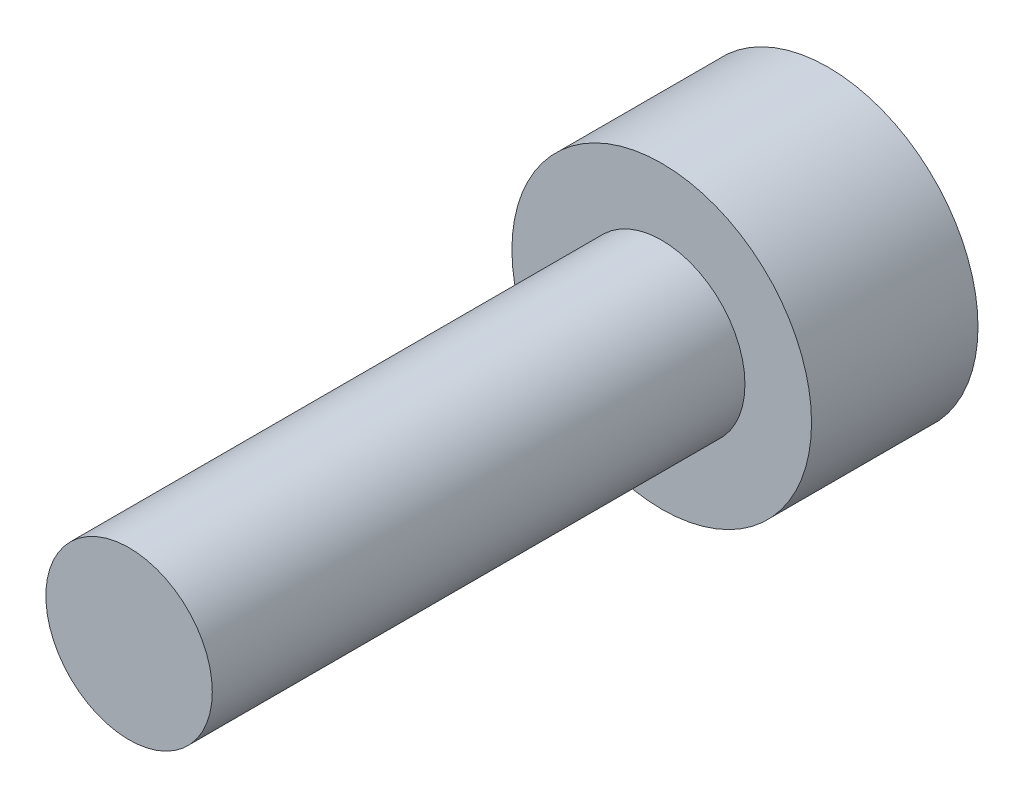
ISO-10303-21;
HEADER;
FILE_DESCRIPTION(('STEP AP214'),'2;1');
FILE_NAME('part.step','',(''),(''),'','','');
FILE_SCHEMA(('AUTOMOTIVE_DESIGN { 1 0 10303 214 1 1 1 1 }'));
ENDSEC;
DATA;
#1=APPLICATION_CONTEXT('core data for automotive mechanical design processes');
#2=APPLICATION_PROTOCOL_DEFINITION('international standard','automotive_design',2000,#1);
#3=PRODUCT_CONTEXT('',#1,'mechanical');
#4=PRODUCT('Part','Part','',(#3));
#5=PRODUCT_RELATED_PRODUCT_CATEGORY('part','',(#4));
#6=PRODUCT_DEFINITION_FORMATION('','',#4);
#7=PRODUCT_DEFINITION_CONTEXT('part definition',#1,'design');
#8=PRODUCT_DEFINITION('design','',#6,#7);
#9=PRODUCT_DEFINITION_SHAPE('','',#8);
#10=(LENGTH_UNIT() NAMED_UNIT(*) SI_UNIT(.MILLI.,.METRE.));
#11=(NAMED_UNIT(*) PLANE_ANGLE_UNIT() SI_UNIT($,.RADIAN.));
#12=(NAMED_UNIT(*) SI_UNIT($,.STERADIAN.) SOLID_ANGLE_UNIT());
#13=UNCERTAINTY_MEASURE_WITH_UNIT(LENGTH_MEASURE(1.E-05),#10,'distance_accuracy_value','');
#14=(GEOMETRIC_REPRESENTATION_CONTEXT(3) GLOBAL_UNCERTAINTY_ASSIGNED_CONTEXT((#13)) GLOBAL_UNIT_ASSIGNED_CONTEXT((#10,
#11,#12)) REPRESENTATION_CONTEXT('',''));
#15=CARTESIAN_POINT('',(0.,0.,0.));
#16=DIRECTION('',(0.,0.,1.));
#17=DIRECTION('',(1.,0.,0.));
#18=AXIS2_PLACEMENT_3D('',#15,#16,#17);
#19=CARTESIAN_POINT('',(0.,0.,-2.5));
#20=DIRECTION('',(0.,0.,1.));
#21=DIRECTION('',(1.,0.,0.));
#22=AXIS2_PLACEMENT_3D('',#19,#20,#21);
#23=PLANE('',#22);
#24=CARTESIAN_POINT('',(0.,0.,-2.5));
#25=DIRECTION('',(0.,0.,1.));
#26=DIRECTION('',(1.,0.,0.));
#27=AXIS2_PLACEMENT_3D('',#24,#25,#26);
#28=CIRCLE('',#27,2.25);
#29=CARTESIAN_POINT('',(2.25,0.,-2.5));
#30=VERTEX_POINT('',#29);
#31=EDGE_CURVE('E47',#30,#30,#28,.T.);
#32=ORIENTED_EDGE('',*,*,#31,.F.);
#33=EDGE_LOOP('',(#32));
#34=FACE_BOUND('',#33,.T.);
#35=DIRECTION('',(0.5,0.866025403784439,0.));
#36=VECTOR('',#35,1.);
#37=CARTESIAN_POINT('',(0.577350269189626,-1.,-2.5));
#38=LINE('',#37,#36);
#39=CARTESIAN_POINT('',(0.577350269189626,-1.,-2.5));
#40=VERTEX_POINT('',#39);
#41=CARTESIAN_POINT('',(1.15470053837925,0.,-2.5));
#42=VERTEX_POINT('',#41);
#43=EDGE_CURVE('E62',#40,#42,#38,.T.);
#44=ORIENTED_EDGE('',*,*,#43,.T.);
#45=DIRECTION('',(-0.5,0.866025403784439,0.));
#46=VECTOR('',#45,1.);
#47=CARTESIAN_POINT('',(1.15470053837925,0.,-2.5));
#48=LINE('',#47,#46);
#49=CARTESIAN_POINT('',(0.577350269189626,1.,-2.5));
#50=VERTEX_POINT('',#49);
#51=EDGE_CURVE('E138',#42,#50,#48,.T.);
#52=ORIENTED_EDGE('',*,*,#51,.T.);
#53=DIRECTION('',(-1.,0.,0.));
#54=VECTOR('',#53,1.);
#55=CARTESIAN_POINT('',(0.577350269189626,1.,-2.5));
#56=LINE('',#55,#54);
#57=CARTESIAN_POINT('',(-0.577350269189626,1.,-2.5));
#58=VERTEX_POINT('',#57);
#59=EDGE_CURVE('E141',#50,#58,#56,.T.);
#60=ORIENTED_EDGE('',*,*,#59,.T.);
#61=DIRECTION('',(-0.5,-0.866025403784438,0.));
#62=VECTOR('',#61,1.);
#63=CARTESIAN_POINT('',(-0.577350269189626,1.,-2.5));
#64=LINE('',#63,#62);
#65=CARTESIAN_POINT('',(-1.15470053837925,0.,-2.5));
#66=VERTEX_POINT('',#65);
#67=EDGE_CURVE('E150',#58,#66,#64,.T.);
#68=ORIENTED_EDGE('',*,*,#67,.T.);
#69=DIRECTION('',(0.5,-0.866025403784439,0.));
#70=VECTOR('',#69,1.);
#71=CARTESIAN_POINT('',(-1.15470053837925,0.,-2.5));
#72=LINE('',#71,#70);
#73=CARTESIAN_POINT('',(-0.577350269189626,-1.,-2.5));
#74=VERTEX_POINT('',#73);
#75=EDGE_CURVE('E125',#66,#74,#72,.T.);
#76=ORIENTED_EDGE('',*,*,#75,.T.);
#77=DIRECTION('',(1.,0.,0.));
#78=VECTOR('',#77,1.);
#79=CARTESIAN_POINT('',(-0.577350269189626,-1.,-2.5));
#80=LINE('',#79,#78);
#81=EDGE_CURVE('E155',#74,#40,#80,.T.);
#82=ORIENTED_EDGE('',*,*,#81,.T.);
#83=EDGE_LOOP('',(#44,#52,#60,#68,#76,#82));
#84=FACE_BOUND('',#83,.T.);
#85=ADVANCED_FACE('F44',(#34,#84),#23,.F.);
#86=CARTESIAN_POINT('',(0.,0.,0.));
#87=DIRECTION('',(0.,0.,-1.));
#88=DIRECTION('',(-1.,0.,0.));
#89=AXIS2_PLACEMENT_3D('',#86,#87,#88);
#90=CYLINDRICAL_SURFACE('',#89,2.25);
#91=CARTESIAN_POINT('',(0.,0.,0.));
#92=DIRECTION('',(0.,0.,1.));
#93=DIRECTION('',(1.,0.,0.));
#94=AXIS2_PLACEMENT_3D('',#91,#92,#93);
#95=CIRCLE('',#94,2.25);
#96=CARTESIAN_POINT('',(2.25,0.,0.));
#97=VERTEX_POINT('',#96);
#98=EDGE_CURVE('E54',#97,#97,#95,.T.);
#99=ORIENTED_EDGE('',*,*,#98,.F.);
#100=EDGE_LOOP('',(#99));
#101=FACE_BOUND('',#100,.T.);
#102=ORIENTED_EDGE('',*,*,#31,.T.);
#103=EDGE_LOOP('',(#102));
#104=FACE_BOUND('',#103,.T.);
#105=ADVANCED_FACE('F50',(#101,#104),#90,.T.);
#106=CARTESIAN_POINT('',(0.,0.,0.));
#107=DIRECTION('',(0.,0.,1.));
#108=DIRECTION('',(1.,0.,0.));
#109=AXIS2_PLACEMENT_3D('',#106,#107,#108);
#110=PLANE('',#109);
#111=CARTESIAN_POINT('',(0.,0.,0.));
#112=DIRECTION('',(0.,0.,1.));
#113=DIRECTION('',(1.,0.,0.));
#114=AXIS2_PLACEMENT_3D('',#111,#112,#113);
#115=CIRCLE('',#114,1.25);
#116=CARTESIAN_POINT('',(1.25,0.,0.));
#117=VERTEX_POINT('',#116);
#118=EDGE_CURVE('E11',#117,#117,#115,.T.);
#119=ORIENTED_EDGE('',*,*,#118,.F.);
#120=EDGE_LOOP('',(#119));
#121=FACE_BOUND('',#120,.T.);
#122=ORIENTED_EDGE('',*,*,#98,.T.);
#123=EDGE_LOOP('',(#122));
#124=FACE_BOUND('',#123,.T.);
#125=ADVANCED_FACE('F212',(#121,#124),#110,.T.);
#126=CARTESIAN_POINT('',(0.,0.,8.));
#127=DIRECTION('',(0.,0.,-1.));
#128=DIRECTION('',(-1.,0.,0.));
#129=AXIS2_PLACEMENT_3D('',#126,#127,#128);
#130=CYLINDRICAL_SURFACE('',#129,1.25);
#131=CARTESIAN_POINT('',(0.,0.,8.));
#132=DIRECTION('',(0.,0.,1.));
#133=DIRECTION('',(1.,0.,0.));
#134=AXIS2_PLACEMENT_3D('',#131,#132,#133);
#135=CIRCLE('',#134,1.25);
#136=CARTESIAN_POINT('',(1.25,0.,8.));
#137=VERTEX_POINT('',#136);
#138=EDGE_CURVE('E166',#137,#137,#135,.T.);
#139=ORIENTED_EDGE('',*,*,#138,.F.);
#140=EDGE_LOOP('',(#139));
#141=FACE_BOUND('',#140,.T.);
#142=ORIENTED_EDGE('',*,*,#118,.T.);
#143=EDGE_LOOP('',(#142));
#144=FACE_BOUND('',#143,.T.);
#145=ADVANCED_FACE('F209',(#141,#144),#130,.T.);
#146=CARTESIAN_POINT('',(0.,0.,8.));
#147=DIRECTION('',(0.,0.,1.));
#148=DIRECTION('',(1.,0.,0.));
#149=AXIS2_PLACEMENT_3D('',#146,#147,#148);
#150=PLANE('',#149);
#151=ORIENTED_EDGE('',*,*,#138,.T.);
#152=EDGE_LOOP('',(#151));
#153=FACE_BOUND('',#152,.T.);
#154=ADVANCED_FACE('F204',(#153),#150,.T.);
#155=CARTESIAN_POINT('',(0.577350269189626,-1.,-1.4));
#156=DIRECTION('',(-0.866025403784439,0.5,0.));
#157=DIRECTION('',(-0.5,-0.866025403784439,0.));
#158=AXIS2_PLACEMENT_3D('',#155,#156,#157);
#159=PLANE('',#158);
#160=ORIENTED_EDGE('',*,*,#43,.F.);
#161=DIRECTION('',(0.,0.,-1.));
#162=VECTOR('',#161,1.);
#163=CARTESIAN_POINT('',(0.577350269189626,-1.,-1.4));
#164=LINE('',#163,#162);
#165=CARTESIAN_POINT('',(0.577350269189626,-1.,-1.4));
#166=VERTEX_POINT('',#165);
#167=EDGE_CURVE('E132',#166,#40,#164,.T.);
#168=ORIENTED_EDGE('',*,*,#167,.F.);
#169=DIRECTION('',(0.5,0.866025403784439,0.));
#170=VECTOR('',#169,1.);
#171=CARTESIAN_POINT('',(0.577350269189626,-1.,-1.4));
#172=LINE('',#171,#170);
#173=CARTESIAN_POINT('',(1.15470053837925,0.,-1.4));
#174=VERTEX_POINT('',#173);
#175=EDGE_CURVE('E156',#166,#174,#172,.T.);
#176=ORIENTED_EDGE('',*,*,#175,.T.);
#177=DIRECTION('',(0.,0.,-1.));
#178=VECTOR('',#177,1.);
#179=CARTESIAN_POINT('',(1.15470053837925,0.,-1.4));
#180=LINE('',#179,#178);
#181=EDGE_CURVE('E167',#174,#42,#180,.T.);
#182=ORIENTED_EDGE('',*,*,#181,.T.);
#183=EDGE_LOOP('',(#160,#168,#176,#182));
#184=FACE_BOUND('',#183,.T.);
#185=ADVANCED_FACE('F184',(#184),#159,.T.);
#186=CARTESIAN_POINT('',(1.15470053837925,0.,-1.4));
#187=DIRECTION('',(-0.866025403784439,-0.5,0.));
#188=DIRECTION('',(0.5,-0.866025403784439,0.));
#189=AXIS2_PLACEMENT_3D('',#186,#187,#188);
#190=PLANE('',#189);
#191=ORIENTED_EDGE('',*,*,#51,.F.);
#192=ORIENTED_EDGE('',*,*,#181,.F.);
#193=DIRECTION('',(-0.5,0.866025403784439,0.));
#194=VECTOR('',#193,1.);
#195=CARTESIAN_POINT('',(1.15470053837925,0.,-1.4));
#196=LINE('',#195,#194);
#197=CARTESIAN_POINT('',(0.577350269189626,1.,-1.4));
#198=VERTEX_POINT('',#197);
#199=EDGE_CURVE('E105',#174,#198,#196,.T.);
#200=ORIENTED_EDGE('',*,*,#199,.T.);
#201=DIRECTION('',(0.,0.,-1.));
#202=VECTOR('',#201,1.);
#203=CARTESIAN_POINT('',(0.577350269189626,1.,-1.4));
#204=LINE('',#203,#202);
#205=EDGE_CURVE('E162',#198,#50,#204,.T.);
#206=ORIENTED_EDGE('',*,*,#205,.T.);
#207=EDGE_LOOP('',(#191,#192,#200,#206));
#208=FACE_BOUND('',#207,.T.);
#209=ADVANCED_FACE('F198',(#208),#190,.T.);
#210=CARTESIAN_POINT('',(0.577350269189626,1.,-1.4));
#211=DIRECTION('',(0.,-1.,0.));
#212=DIRECTION('',(1.,0.,0.));
#213=AXIS2_PLACEMENT_3D('',#210,#211,#212);
#214=PLANE('',#213);
#215=ORIENTED_EDGE('',*,*,#59,.F.);
#216=ORIENTED_EDGE('',*,*,#205,.F.);
#217=DIRECTION('',(-1.,0.,0.));
#218=VECTOR('',#217,1.);
#219=CARTESIAN_POINT('',(0.577350269189626,1.,-1.4));
#220=LINE('',#219,#218);
#221=CARTESIAN_POINT('',(-0.577350269189626,1.,-1.4));
#222=VERTEX_POINT('',#221);
#223=EDGE_CURVE('E121',#198,#222,#220,.T.);
#224=ORIENTED_EDGE('',*,*,#223,.T.);
#225=DIRECTION('',(0.,0.,-1.));
#226=VECTOR('',#225,1.);
#227=CARTESIAN_POINT('',(-0.577350269189626,1.,-1.4));
#228=LINE('',#227,#226);
#229=EDGE_CURVE('E119',#222,#58,#228,.T.);
#230=ORIENTED_EDGE('',*,*,#229,.T.);
#231=EDGE_LOOP('',(#215,#216,#224,#230));
#232=FACE_BOUND('',#231,.T.);
#233=ADVANCED_FACE('F193',(#232),#214,.T.);
#234=CARTESIAN_POINT('',(-0.577350269189626,1.,-1.4));
#235=DIRECTION('',(0.866025403784438,-0.5,0.));
#236=DIRECTION('',(0.5,0.866025403784438,0.));
#237=AXIS2_PLACEMENT_3D('',#234,#235,#236);
#238=PLANE('',#237);
#239=ORIENTED_EDGE('',*,*,#67,.F.);
#240=ORIENTED_EDGE('',*,*,#229,.F.);
#241=DIRECTION('',(-0.5,-0.866025403784438,0.));
#242=VECTOR('',#241,1.);
#243=CARTESIAN_POINT('',(-0.577350269189626,1.,-1.4));
#244=LINE('',#243,#242);
#245=CARTESIAN_POINT('',(-1.15470053837925,0.,-1.4));
#246=VERTEX_POINT('',#245);
#247=EDGE_CURVE('E115',#222,#246,#244,.T.);
#248=ORIENTED_EDGE('',*,*,#247,.T.);
#249=DIRECTION('',(0.,0.,-1.));
#250=VECTOR('',#249,1.);
#251=CARTESIAN_POINT('',(-1.15470053837925,0.,-1.4));
#252=LINE('',#251,#250);
#253=EDGE_CURVE('E118',#246,#66,#252,.T.);
#254=ORIENTED_EDGE('',*,*,#253,.T.);
#255=EDGE_LOOP('',(#239,#240,#248,#254));
#256=FACE_BOUND('',#255,.T.);
#257=ADVANCED_FACE('F113',(#256),#238,.T.);
#258=CARTESIAN_POINT('',(-1.15470053837925,0.,-1.4));
#259=DIRECTION('',(0.866025403784439,0.5,0.));
#260=DIRECTION('',(-0.5,0.866025403784439,0.));
#261=AXIS2_PLACEMENT_3D('',#258,#259,#260);
#262=PLANE('',#261);
#263=ORIENTED_EDGE('',*,*,#75,.F.);
#264=ORIENTED_EDGE('',*,*,#253,.F.);
#265=DIRECTION('',(0.5,-0.866025403784439,0.));
#266=VECTOR('',#265,1.);
#267=CARTESIAN_POINT('',(-1.15470053837925,0.,-1.4));
#268=LINE('',#267,#266);
#269=CARTESIAN_POINT('',(-0.577350269189626,-1.,-1.4));
#270=VERTEX_POINT('',#269);
#271=EDGE_CURVE('E116',#246,#270,#268,.T.);
#272=ORIENTED_EDGE('',*,*,#271,.T.);
#273=DIRECTION('',(0.,0.,-1.));
#274=VECTOR('',#273,1.);
#275=CARTESIAN_POINT('',(-0.577350269189626,-1.,-1.4));
#276=LINE('',#275,#274);
#277=EDGE_CURVE('E91',#270,#74,#276,.T.);
#278=ORIENTED_EDGE('',*,*,#277,.T.);
#279=EDGE_LOOP('',(#263,#264,#272,#278));
#280=FACE_BOUND('',#279,.T.);
#281=ADVANCED_FACE('F124',(#280),#262,.T.);
#282=CARTESIAN_POINT('',(-0.577350269189626,-1.,-1.4));
#283=DIRECTION('',(0.,1.,0.));
#284=DIRECTION('',(0.,0.,1.));
#285=AXIS2_PLACEMENT_3D('',#282,#283,#284);
#286=PLANE('',#285);
#287=ORIENTED_EDGE('',*,*,#81,.F.);
#288=ORIENTED_EDGE('',*,*,#277,.F.);
#289=DIRECTION('',(1.,0.,0.));
#290=VECTOR('',#289,1.);
#291=CARTESIAN_POINT('',(-0.577350269189626,-1.,-1.4));
#292=LINE('',#291,#290);
#293=EDGE_CURVE('E72',#270,#166,#292,.T.);
#294=ORIENTED_EDGE('',*,*,#293,.T.);
#295=ORIENTED_EDGE('',*,*,#167,.T.);
#296=EDGE_LOOP('',(#287,#288,#294,#295));
#297=FACE_BOUND('',#296,.T.);
#298=ADVANCED_FACE('F181',(#297),#286,.T.);
#299=CARTESIAN_POINT('',(0.,0.,-1.4));
#300=DIRECTION('',(0.,0.,1.));
#301=DIRECTION('',(1.,0.,0.));
#302=AXIS2_PLACEMENT_3D('',#299,#300,#301);
#303=PLANE('',#302);
#304=ORIENTED_EDGE('',*,*,#175,.F.);
#305=ORIENTED_EDGE('',*,*,#293,.F.);
#306=ORIENTED_EDGE('',*,*,#271,.F.);
#307=ORIENTED_EDGE('',*,*,#247,.F.);
#308=ORIENTED_EDGE('',*,*,#223,.F.);
#309=ORIENTED_EDGE('',*,*,#199,.F.);
#310=EDGE_LOOP('',(#304,#305,#306,#307,#308,#309));
#311=FACE_BOUND('',#310,.T.);
#312=ADVANCED_FACE('F129',(#311),#303,.F.);
#313=CLOSED_SHELL('',(#85,#105,#125,#145,#154,#185,#209,#233,#257,#281,#298,#312));
#314=MANIFOLD_SOLID_BREP('B2',#313);
#315=ADVANCED_BREP_SHAPE_REPRESENTATION('',(#18,#314),#14);
#316=SHAPE_DEFINITION_REPRESENTATION(#9,#315);
ENDSEC;
END-ISO-10303-21;
